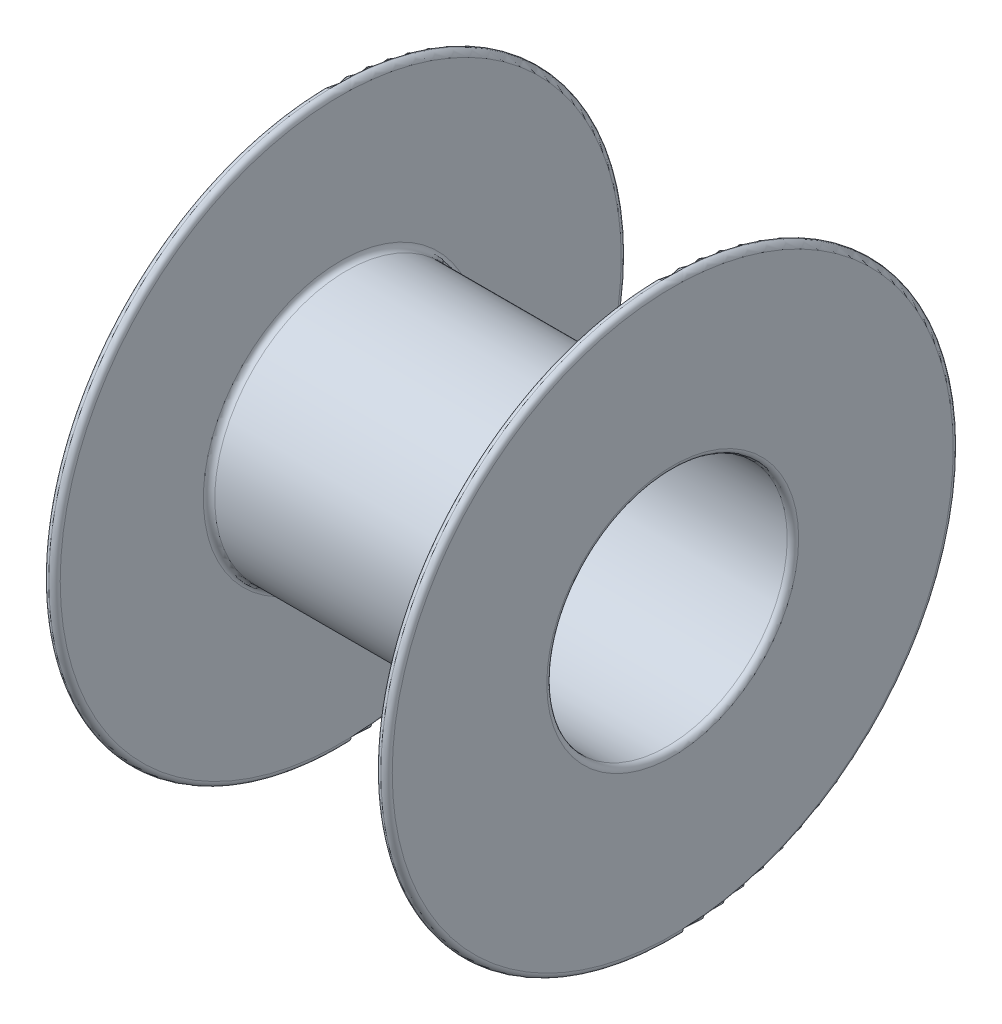
ISO-10303-21;
HEADER;
FILE_DESCRIPTION(('STEP AP214'),'2;1');
FILE_NAME('part.step','',(''),(''),'','','');
FILE_SCHEMA(('AUTOMOTIVE_DESIGN { 1 0 10303 214 1 1 1 1 }'));
ENDSEC;
DATA;
#1=APPLICATION_CONTEXT('core data for automotive mechanical design processes');
#2=APPLICATION_PROTOCOL_DEFINITION('international standard','automotive_design',2000,#1);
#3=PRODUCT_CONTEXT('',#1,'mechanical');
#4=PRODUCT('Part','Part','',(#3));
#5=PRODUCT_RELATED_PRODUCT_CATEGORY('part','',(#4));
#6=PRODUCT_DEFINITION_FORMATION('','',#4);
#7=PRODUCT_DEFINITION_CONTEXT('part definition',#1,'design');
#8=PRODUCT_DEFINITION('design','',#6,#7);
#9=PRODUCT_DEFINITION_SHAPE('','',#8);
#10=(LENGTH_UNIT() NAMED_UNIT(*) SI_UNIT(.MILLI.,.METRE.));
#11=(NAMED_UNIT(*) PLANE_ANGLE_UNIT() SI_UNIT($,.RADIAN.));
#12=(NAMED_UNIT(*) SI_UNIT($,.STERADIAN.) SOLID_ANGLE_UNIT());
#13=UNCERTAINTY_MEASURE_WITH_UNIT(LENGTH_MEASURE(1.E-05),#10,'distance_accuracy_value','');
#14=(GEOMETRIC_REPRESENTATION_CONTEXT(3) GLOBAL_UNCERTAINTY_ASSIGNED_CONTEXT((#13)) GLOBAL_UNIT_ASSIGNED_CONTEXT((#10,
#11,#12)) REPRESENTATION_CONTEXT('',''));
#15=CARTESIAN_POINT('',(0.,0.,0.));
#16=DIRECTION('',(0.,0.,1.));
#17=DIRECTION('',(1.,0.,0.));
#18=AXIS2_PLACEMENT_3D('',#15,#16,#17);
#19=CARTESIAN_POINT('',(15.,0.,0.));
#20=DIRECTION('',(-1.,0.,0.));
#21=DIRECTION('',(0.,0.,1.));
#22=AXIS2_PLACEMENT_3D('',#19,#20,#21);
#23=CYLINDRICAL_SURFACE('',#22,11.5);
#24=CARTESIAN_POINT('',(-13.5,0.,0.));
#25=DIRECTION('',(1.,0.,0.));
#26=DIRECTION('',(0.,0.,-1.));
#27=AXIS2_PLACEMENT_3D('',#24,#25,#26);
#28=CIRCLE('',#27,11.5);
#29=CARTESIAN_POINT('',(-13.5,0.,-11.5));
#30=VERTEX_POINT('',#29);
#31=EDGE_CURVE('E58',#30,#30,#28,.T.);
#32=ORIENTED_EDGE('',*,*,#31,.T.);
#33=EDGE_LOOP('',(#32));
#34=FACE_BOUND('',#33,.T.);
#35=CARTESIAN_POINT('',(13.5,0.,0.));
#36=DIRECTION('',(1.,0.,0.));
#37=DIRECTION('',(0.,0.,-1.));
#38=AXIS2_PLACEMENT_3D('',#35,#36,#37);
#39=CIRCLE('',#38,11.5);
#40=CARTESIAN_POINT('',(13.5,0.,-11.5));
#41=VERTEX_POINT('',#40);
#42=EDGE_CURVE('E54',#41,#41,#39,.F.);
#43=ORIENTED_EDGE('',*,*,#42,.T.);
#44=EDGE_LOOP('',(#43));
#45=FACE_BOUND('',#44,.T.);
#46=ADVANCED_FACE('F36',(#34,#45),#23,.T.);
#47=CARTESIAN_POINT('',(15.,0.,0.));
#48=DIRECTION('',(-1.,0.,0.));
#49=DIRECTION('',(0.,0.,1.));
#50=AXIS2_PLACEMENT_3D('',#47,#48,#49);
#51=CYLINDRICAL_SURFACE('',#50,10.5);
#52=CARTESIAN_POINT('',(-14.5,0.,0.));
#53=DIRECTION('',(1.,0.,0.));
#54=DIRECTION('',(0.,0.,-1.));
#55=AXIS2_PLACEMENT_3D('',#52,#53,#54);
#56=CIRCLE('',#55,10.5);
#57=CARTESIAN_POINT('',(-14.5,0.,-10.5));
#58=VERTEX_POINT('',#57);
#59=EDGE_CURVE('E49',#58,#58,#56,.F.);
#60=ORIENTED_EDGE('',*,*,#59,.T.);
#61=EDGE_LOOP('',(#60));
#62=FACE_BOUND('',#61,.T.);
#63=CARTESIAN_POINT('',(14.5,0.,0.));
#64=DIRECTION('',(1.,0.,0.));
#65=DIRECTION('',(0.,0.,-1.));
#66=AXIS2_PLACEMENT_3D('',#63,#64,#65);
#67=CIRCLE('',#66,10.5);
#68=CARTESIAN_POINT('',(14.5,0.,-10.5));
#69=VERTEX_POINT('',#68);
#70=EDGE_CURVE('E124',#69,#69,#67,.T.);
#71=ORIENTED_EDGE('',*,*,#70,.T.);
#72=EDGE_LOOP('',(#71));
#73=FACE_BOUND('',#72,.T.);
#74=ADVANCED_FACE('F82',(#62,#73),#51,.F.);
#75=CARTESIAN_POINT('',(15.,0.,0.));
#76=DIRECTION('',(1.,0.,0.));
#77=DIRECTION('',(0.,0.,-1.));
#78=AXIS2_PLACEMENT_3D('',#75,#76,#77);
#79=PLANE('',#78);
#80=CARTESIAN_POINT('',(15.,0.,0.));
#81=DIRECTION('',(1.,0.,0.));
#82=DIRECTION('',(0.,0.,-1.));
#83=AXIS2_PLACEMENT_3D('',#80,#81,#82);
#84=CIRCLE('',#83,11.);
#85=CARTESIAN_POINT('',(15.,0.,-11.));
#86=VERTEX_POINT('',#85);
#87=EDGE_CURVE('E10',#86,#86,#84,.F.);
#88=ORIENTED_EDGE('',*,*,#87,.T.);
#89=EDGE_LOOP('',(#88));
#90=FACE_BOUND('',#89,.T.);
#91=CARTESIAN_POINT('',(15.,0.,0.));
#92=DIRECTION('',(1.,0.,0.));
#93=DIRECTION('',(0.,0.,-1.));
#94=AXIS2_PLACEMENT_3D('',#91,#92,#93);
#95=CIRCLE('',#94,24.5);
#96=CARTESIAN_POINT('',(15.,0.,-24.5));
#97=VERTEX_POINT('',#96);
#98=EDGE_CURVE('E44',#97,#97,#95,.T.);
#99=ORIENTED_EDGE('',*,*,#98,.T.);
#100=EDGE_LOOP('',(#99));
#101=FACE_BOUND('',#100,.T.);
#102=ADVANCED_FACE('F88',(#90,#101),#79,.T.);
#103=CARTESIAN_POINT('',(-15.,0.,0.));
#104=DIRECTION('',(1.,0.,0.));
#105=DIRECTION('',(0.,0.,-1.));
#106=AXIS2_PLACEMENT_3D('',#103,#104,#105);
#107=PLANE('',#106);
#108=CARTESIAN_POINT('',(-15.,0.,0.));
#109=DIRECTION('',(1.,0.,0.));
#110=DIRECTION('',(0.,0.,-1.));
#111=AXIS2_PLACEMENT_3D('',#108,#109,#110);
#112=CIRCLE('',#111,24.5);
#113=CARTESIAN_POINT('',(-15.,0.,-24.5));
#114=VERTEX_POINT('',#113);
#115=EDGE_CURVE('E109',#114,#114,#112,.F.);
#116=ORIENTED_EDGE('',*,*,#115,.T.);
#117=EDGE_LOOP('',(#116));
#118=FACE_BOUND('',#117,.T.);
#119=CARTESIAN_POINT('',(-15.,0.,0.));
#120=DIRECTION('',(1.,0.,0.));
#121=DIRECTION('',(0.,0.,-1.));
#122=AXIS2_PLACEMENT_3D('',#119,#120,#121);
#123=CIRCLE('',#122,11.);
#124=CARTESIAN_POINT('',(-15.,0.,-11.));
#125=VERTEX_POINT('',#124);
#126=EDGE_CURVE('E112',#125,#125,#123,.T.);
#127=ORIENTED_EDGE('',*,*,#126,.T.);
#128=EDGE_LOOP('',(#127));
#129=FACE_BOUND('',#128,.T.);
#130=ADVANCED_FACE('F94',(#118,#129),#107,.F.);
#131=CARTESIAN_POINT('',(14.,0.,0.));
#132=DIRECTION('',(1.,0.,0.));
#133=DIRECTION('',(0.,0.,-1.));
#134=AXIS2_PLACEMENT_3D('',#131,#132,#133);
#135=PLANE('',#134);
#136=CARTESIAN_POINT('',(14.,0.,0.));
#137=DIRECTION('',(1.,0.,0.));
#138=DIRECTION('',(0.,0.,-1.));
#139=AXIS2_PLACEMENT_3D('',#136,#137,#138);
#140=CIRCLE('',#139,24.5);
#141=CARTESIAN_POINT('',(14.,0.,-24.5));
#142=VERTEX_POINT('',#141);
#143=EDGE_CURVE('E115',#142,#142,#140,.F.);
#144=ORIENTED_EDGE('',*,*,#143,.T.);
#145=EDGE_LOOP('',(#144));
#146=FACE_BOUND('',#145,.T.);
#147=CARTESIAN_POINT('',(14.,0.,0.));
#148=DIRECTION('',(1.,0.,0.));
#149=DIRECTION('',(0.,0.,-1.));
#150=AXIS2_PLACEMENT_3D('',#147,#148,#149);
#151=CIRCLE('',#150,12.);
#152=CARTESIAN_POINT('',(14.,0.,-12.));
#153=VERTEX_POINT('',#152);
#154=EDGE_CURVE('E111',#153,#153,#151,.T.);
#155=ORIENTED_EDGE('',*,*,#154,.T.);
#156=EDGE_LOOP('',(#155));
#157=FACE_BOUND('',#156,.T.);
#158=ADVANCED_FACE('F136',(#146,#157),#135,.F.);
#159=CARTESIAN_POINT('',(-14.,0.,0.));
#160=DIRECTION('',(1.,0.,0.));
#161=DIRECTION('',(0.,0.,-1.));
#162=AXIS2_PLACEMENT_3D('',#159,#160,#161);
#163=PLANE('',#162);
#164=CARTESIAN_POINT('',(-14.,0.,0.));
#165=DIRECTION('',(1.,0.,0.));
#166=DIRECTION('',(0.,0.,-1.));
#167=AXIS2_PLACEMENT_3D('',#164,#165,#166);
#168=CIRCLE('',#167,12.);
#169=CARTESIAN_POINT('',(-14.,0.,-12.));
#170=VERTEX_POINT('',#169);
#171=EDGE_CURVE('E118',#170,#170,#168,.F.);
#172=ORIENTED_EDGE('',*,*,#171,.T.);
#173=EDGE_LOOP('',(#172));
#174=FACE_BOUND('',#173,.T.);
#175=CARTESIAN_POINT('',(-14.,0.,0.));
#176=DIRECTION('',(1.,0.,0.));
#177=DIRECTION('',(0.,0.,-1.));
#178=AXIS2_PLACEMENT_3D('',#175,#176,#177);
#179=CIRCLE('',#178,24.5);
#180=CARTESIAN_POINT('',(-14.,0.,-24.5));
#181=VERTEX_POINT('',#180);
#182=EDGE_CURVE('E156',#181,#181,#179,.T.);
#183=ORIENTED_EDGE('',*,*,#182,.T.);
#184=EDGE_LOOP('',(#183));
#185=FACE_BOUND('',#184,.T.);
#186=ADVANCED_FACE('F99',(#174,#185),#163,.T.);
#187=CARTESIAN_POINT('',(-13.5,0.,0.));
#188=DIRECTION('',(1.,0.,0.));
#189=DIRECTION('',(0.,0.,-1.));
#190=AXIS2_PLACEMENT_3D('',#187,#188,#189);
#191=TOROIDAL_SURFACE('',#190,12.,0.5);
#192=ORIENTED_EDGE('',*,*,#171,.F.);
#193=EDGE_LOOP('',(#192));
#194=FACE_BOUND('',#193,.T.);
#195=ORIENTED_EDGE('',*,*,#31,.F.);
#196=EDGE_LOOP('',(#195));
#197=FACE_BOUND('',#196,.T.);
#198=ADVANCED_FACE('F97',(#194,#197),#191,.F.);
#199=CARTESIAN_POINT('',(-14.5,0.,0.));
#200=DIRECTION('',(1.,0.,0.));
#201=DIRECTION('',(0.,0.,-1.));
#202=AXIS2_PLACEMENT_3D('',#199,#200,#201);
#203=TOROIDAL_SURFACE('',#202,24.5,0.5);
#204=ORIENTED_EDGE('',*,*,#115,.F.);
#205=EDGE_LOOP('',(#204));
#206=FACE_BOUND('',#205,.T.);
#207=CARTESIAN_POINT('',(-14.5,0.,0.));
#208=DIRECTION('',(1.,0.,0.));
#209=DIRECTION('',(0.,0.,-1.));
#210=AXIS2_PLACEMENT_3D('',#207,#208,#209);
#211=CIRCLE('',#210,25.);
#212=CARTESIAN_POINT('',(-14.5,0.,-25.));
#213=VERTEX_POINT('',#212);
#214=EDGE_CURVE('E52',#213,#213,#211,.T.);
#215=ORIENTED_EDGE('',*,*,#214,.F.);
#216=EDGE_LOOP('',(#215));
#217=FACE_BOUND('',#216,.T.);
#218=ADVANCED_FACE('F77',(#206,#217),#203,.T.);
#219=CARTESIAN_POINT('',(-14.5,0.,0.));
#220=DIRECTION('',(1.,0.,0.));
#221=DIRECTION('',(0.,0.,-1.));
#222=AXIS2_PLACEMENT_3D('',#219,#220,#221);
#223=TOROIDAL_SURFACE('',#222,24.5,0.5);
#224=ORIENTED_EDGE('',*,*,#214,.T.);
#225=EDGE_LOOP('',(#224));
#226=FACE_BOUND('',#225,.T.);
#227=ORIENTED_EDGE('',*,*,#182,.F.);
#228=EDGE_LOOP('',(#227));
#229=FACE_BOUND('',#228,.T.);
#230=ADVANCED_FACE('F67',(#226,#229),#223,.T.);
#231=CARTESIAN_POINT('',(14.5,0.,0.));
#232=DIRECTION('',(1.,0.,0.));
#233=DIRECTION('',(0.,0.,-1.));
#234=AXIS2_PLACEMENT_3D('',#231,#232,#233);
#235=TOROIDAL_SURFACE('',#234,24.5,0.5);
#236=ORIENTED_EDGE('',*,*,#98,.F.);
#237=EDGE_LOOP('',(#236));
#238=FACE_BOUND('',#237,.T.);
#239=CARTESIAN_POINT('',(14.5,0.,0.));
#240=DIRECTION('',(1.,0.,0.));
#241=DIRECTION('',(0.,0.,-1.));
#242=AXIS2_PLACEMENT_3D('',#239,#240,#241);
#243=CIRCLE('',#242,25.);
#244=CARTESIAN_POINT('',(14.5,0.,-25.));
#245=VERTEX_POINT('',#244);
#246=EDGE_CURVE('E40',#245,#245,#243,.F.);
#247=ORIENTED_EDGE('',*,*,#246,.F.);
#248=EDGE_LOOP('',(#247));
#249=FACE_BOUND('',#248,.T.);
#250=ADVANCED_FACE('F65',(#238,#249),#235,.T.);
#251=CARTESIAN_POINT('',(14.5,0.,0.));
#252=DIRECTION('',(1.,0.,0.));
#253=DIRECTION('',(0.,0.,-1.));
#254=AXIS2_PLACEMENT_3D('',#251,#252,#253);
#255=TOROIDAL_SURFACE('',#254,24.5,0.5);
#256=ORIENTED_EDGE('',*,*,#143,.F.);
#257=EDGE_LOOP('',(#256));
#258=FACE_BOUND('',#257,.T.);
#259=ORIENTED_EDGE('',*,*,#246,.T.);
#260=EDGE_LOOP('',(#259));
#261=FACE_BOUND('',#260,.T.);
#262=ADVANCED_FACE('F63',(#258,#261),#255,.T.);
#263=CARTESIAN_POINT('',(-14.5,0.,0.));
#264=DIRECTION('',(1.,0.,0.));
#265=DIRECTION('',(0.,0.,-1.));
#266=AXIS2_PLACEMENT_3D('',#263,#264,#265);
#267=TOROIDAL_SURFACE('',#266,11.,0.5);
#268=ORIENTED_EDGE('',*,*,#59,.F.);
#269=EDGE_LOOP('',(#268));
#270=FACE_BOUND('',#269,.T.);
#271=ORIENTED_EDGE('',*,*,#126,.F.);
#272=EDGE_LOOP('',(#271));
#273=FACE_BOUND('',#272,.T.);
#274=ADVANCED_FACE('F74',(#270,#273),#267,.T.);
#275=CARTESIAN_POINT('',(14.5,0.,0.));
#276=DIRECTION('',(1.,0.,0.));
#277=DIRECTION('',(0.,0.,-1.));
#278=AXIS2_PLACEMENT_3D('',#275,#276,#277);
#279=TOROIDAL_SURFACE('',#278,11.,0.5);
#280=ORIENTED_EDGE('',*,*,#87,.F.);
#281=EDGE_LOOP('',(#280));
#282=FACE_BOUND('',#281,.T.);
#283=ORIENTED_EDGE('',*,*,#70,.F.);
#284=EDGE_LOOP('',(#283));
#285=FACE_BOUND('',#284,.T.);
#286=ADVANCED_FACE('F132',(#282,#285),#279,.T.);
#287=CARTESIAN_POINT('',(13.5,0.,0.));
#288=DIRECTION('',(1.,0.,0.));
#289=DIRECTION('',(0.,0.,-1.));
#290=AXIS2_PLACEMENT_3D('',#287,#288,#289);
#291=TOROIDAL_SURFACE('',#290,12.,0.5);
#292=ORIENTED_EDGE('',*,*,#42,.F.);
#293=EDGE_LOOP('',(#292));
#294=FACE_BOUND('',#293,.T.);
#295=ORIENTED_EDGE('',*,*,#154,.F.);
#296=EDGE_LOOP('',(#295));
#297=FACE_BOUND('',#296,.T.);
#298=ADVANCED_FACE('F38',(#294,#297),#291,.F.);
#299=CLOSED_SHELL('',(#46,#74,#102,#130,#158,#186,#198,#218,#230,#250,#262,#274,#286,#298));
#300=MANIFOLD_SOLID_BREP('B2',#299);
#301=ADVANCED_BREP_SHAPE_REPRESENTATION('',(#18,#300),#14);
#302=SHAPE_DEFINITION_REPRESENTATION(#9,#301);
ENDSEC;
END-ISO-10303-21;
